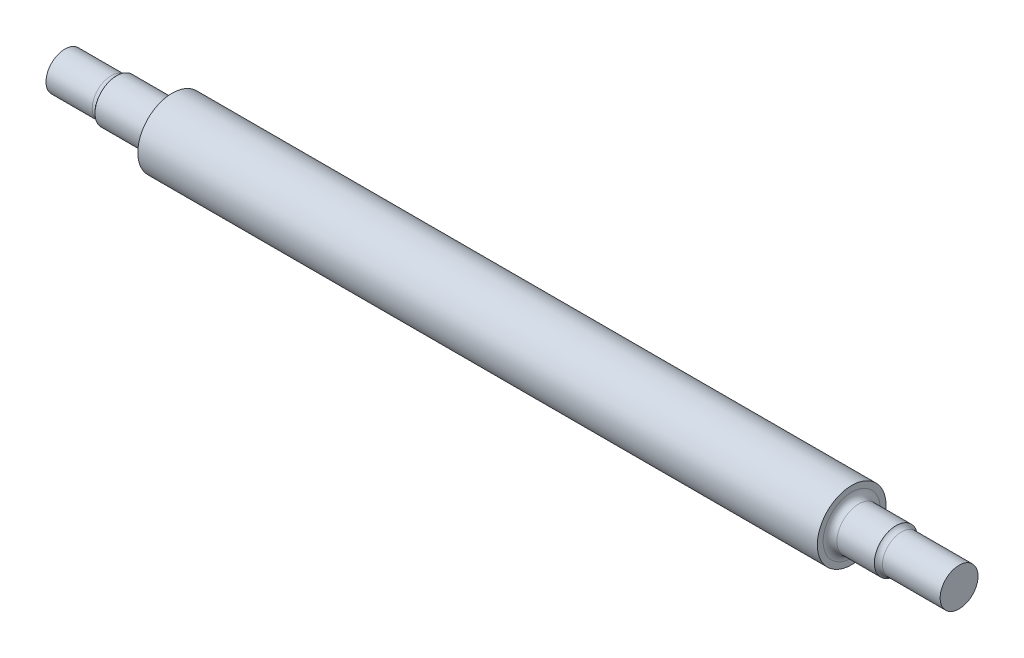
ISO-10303-21;
HEADER;
FILE_DESCRIPTION(('STEP AP214'),'2;1');
FILE_NAME('part.step','',(''),(''),'','','');
FILE_SCHEMA(('AUTOMOTIVE_DESIGN { 1 0 10303 214 1 1 1 1 }'));
ENDSEC;
DATA;
#1=APPLICATION_CONTEXT('core data for automotive mechanical design processes');
#2=APPLICATION_PROTOCOL_DEFINITION('international standard','automotive_design',2000,#1);
#3=PRODUCT_CONTEXT('',#1,'mechanical');
#4=PRODUCT('Part','Part','',(#3));
#5=PRODUCT_RELATED_PRODUCT_CATEGORY('part','',(#4));
#6=PRODUCT_DEFINITION_FORMATION('','',#4);
#7=PRODUCT_DEFINITION_CONTEXT('part definition',#1,'design');
#8=PRODUCT_DEFINITION('design','',#6,#7);
#9=PRODUCT_DEFINITION_SHAPE('','',#8);
#10=(LENGTH_UNIT() NAMED_UNIT(*) SI_UNIT(.MILLI.,.METRE.));
#11=(NAMED_UNIT(*) PLANE_ANGLE_UNIT() SI_UNIT($,.RADIAN.));
#12=(NAMED_UNIT(*) SI_UNIT($,.STERADIAN.) SOLID_ANGLE_UNIT());
#13=UNCERTAINTY_MEASURE_WITH_UNIT(LENGTH_MEASURE(1.E-05),#10,'distance_accuracy_value','');
#14=(GEOMETRIC_REPRESENTATION_CONTEXT(3) GLOBAL_UNCERTAINTY_ASSIGNED_CONTEXT((#13)) GLOBAL_UNIT_ASSIGNED_CONTEXT((#10,
#11,#12)) REPRESENTATION_CONTEXT('',''));
#15=CARTESIAN_POINT('',(0.,0.,0.));
#16=DIRECTION('',(0.,0.,1.));
#17=DIRECTION('',(1.,0.,0.));
#18=AXIS2_PLACEMENT_3D('',#15,#16,#17);
#19=CARTESIAN_POINT('',(87.741935483871,0.,-3.5));
#20=DIRECTION('',(1.,0.,0.));
#21=DIRECTION('',(0.,0.,-1.));
#22=AXIS2_PLACEMENT_3D('',#19,#20,#21);
#23=PLANE('',#22);
#24=CARTESIAN_POINT('',(87.741935483871,0.,0.));
#25=DIRECTION('',(-1.,0.,0.));
#26=DIRECTION('',(0.,0.,1.));
#27=AXIS2_PLACEMENT_3D('',#24,#25,#26);
#28=CIRCLE('',#27,3.5);
#29=CARTESIAN_POINT('',(87.741935483871,0.,3.5));
#30=VERTEX_POINT('',#29);
#31=EDGE_CURVE('E65',#30,#30,#28,.T.);
#32=ORIENTED_EDGE('',*,*,#31,.F.);
#33=EDGE_LOOP('',(#32));
#34=FACE_BOUND('',#33,.T.);
#35=ADVANCED_FACE('F38',(#34),#23,.T.);
#36=CARTESIAN_POINT('',(-77.4193548387097,0.,0.));
#37=DIRECTION('',(-1.,0.,0.));
#38=DIRECTION('',(0.,0.,1.));
#39=AXIS2_PLACEMENT_3D('',#36,#37,#38);
#40=CYLINDRICAL_SURFACE('',#39,3.5);
#41=CARTESIAN_POINT('',(77.092283397062,0.,0.));
#42=DIRECTION('',(-1.,0.,0.));
#43=DIRECTION('',(0.,0.,1.));
#44=AXIS2_PLACEMENT_3D('',#41,#42,#43);
#45=CIRCLE('',#44,3.5);
#46=CARTESIAN_POINT('',(77.092283397062,0.,3.5));
#47=VERTEX_POINT('',#46);
#48=EDGE_CURVE('E50',#47,#47,#45,.F.);
#49=ORIENTED_EDGE('',*,*,#48,.T.);
#50=EDGE_LOOP('',(#49));
#51=FACE_BOUND('',#50,.T.);
#52=ORIENTED_EDGE('',*,*,#31,.T.);
#53=EDGE_LOOP('',(#52));
#54=FACE_BOUND('',#53,.T.);
#55=ADVANCED_FACE('F206',(#51,#54),#40,.T.);
#56=CARTESIAN_POINT('',(-77.4193548387097,0.,0.));
#57=DIRECTION('',(-1.,0.,0.));
#58=DIRECTION('',(0.,0.,1.));
#59=AXIS2_PLACEMENT_3D('',#56,#57,#58);
#60=CYLINDRICAL_SURFACE('',#59,4.);
#61=CARTESIAN_POINT('',(69.1744232258064,0.,0.));
#62=DIRECTION('',(1.,0.,0.));
#63=DIRECTION('',(0.,0.,-1.));
#64=AXIS2_PLACEMENT_3D('',#61,#62,#63);
#65=CIRCLE('',#64,4.);
#66=CARTESIAN_POINT('',(69.1744232258064,0.,-4.));
#67=VERTEX_POINT('',#66);
#68=EDGE_CURVE('E10',#67,#67,#65,.T.);
#69=ORIENTED_EDGE('',*,*,#68,.T.);
#70=EDGE_LOOP('',(#69));
#71=FACE_BOUND('',#70,.T.);
#72=CARTESIAN_POINT('',(76.0823329032258,0.,0.));
#73=DIRECTION('',(-1.,0.,0.));
#74=DIRECTION('',(0.,0.,1.));
#75=AXIS2_PLACEMENT_3D('',#72,#73,#74);
#76=CIRCLE('',#75,4.);
#77=CARTESIAN_POINT('',(76.0823329032258,0.,4.));
#78=VERTEX_POINT('',#77);
#79=EDGE_CURVE('E68',#78,#78,#76,.T.);
#80=ORIENTED_EDGE('',*,*,#79,.T.);
#81=EDGE_LOOP('',(#80));
#82=FACE_BOUND('',#81,.T.);
#83=ADVANCED_FACE('F203',(#71,#82),#60,.T.);
#84=CARTESIAN_POINT('',(67.9044232258064,0.,-6.35));
#85=DIRECTION('',(1.,0.,0.));
#86=DIRECTION('',(0.,0.,-1.));
#87=AXIS2_PLACEMENT_3D('',#84,#85,#86);
#88=PLANE('',#87);
#89=CARTESIAN_POINT('',(67.9044232258064,0.,0.));
#90=DIRECTION('',(1.,0.,0.));
#91=DIRECTION('',(0.,0.,-1.));
#92=AXIS2_PLACEMENT_3D('',#89,#90,#91);
#93=CIRCLE('',#92,5.27);
#94=CARTESIAN_POINT('',(67.9044232258064,0.,-5.27));
#95=VERTEX_POINT('',#94);
#96=EDGE_CURVE('E46',#95,#95,#93,.F.);
#97=ORIENTED_EDGE('',*,*,#96,.T.);
#98=EDGE_LOOP('',(#97));
#99=FACE_BOUND('',#98,.T.);
#100=CARTESIAN_POINT('',(67.9044232258065,0.,0.));
#101=DIRECTION('',(-1.,0.,0.));
#102=DIRECTION('',(0.,0.,1.));
#103=AXIS2_PLACEMENT_3D('',#100,#101,#102);
#104=CIRCLE('',#103,6.35);
#105=CARTESIAN_POINT('',(67.9044232258065,0.,6.35));
#106=VERTEX_POINT('',#105);
#107=EDGE_CURVE('E71',#106,#106,#104,.T.);
#108=ORIENTED_EDGE('',*,*,#107,.F.);
#109=EDGE_LOOP('',(#108));
#110=FACE_BOUND('',#109,.T.);
#111=ADVANCED_FACE('F199',(#99,#110),#88,.T.);
#112=CARTESIAN_POINT('',(-77.4193548387097,0.,0.));
#113=DIRECTION('',(-1.,0.,0.));
#114=DIRECTION('',(0.,0.,1.));
#115=AXIS2_PLACEMENT_3D('',#112,#113,#114);
#116=CYLINDRICAL_SURFACE('',#115,6.35);
#117=ORIENTED_EDGE('',*,*,#107,.T.);
#118=EDGE_LOOP('',(#117));
#119=FACE_BOUND('',#118,.T.);
#120=CARTESIAN_POINT('',(-57.6087122580646,0.,0.));
#121=DIRECTION('',(-1.,0.,0.));
#122=DIRECTION('',(0.,0.,1.));
#123=AXIS2_PLACEMENT_3D('',#120,#121,#122);
#124=CIRCLE('',#123,6.35);
#125=CARTESIAN_POINT('',(-57.6087122580646,0.,6.35));
#126=VERTEX_POINT('',#125);
#127=EDGE_CURVE('E74',#126,#126,#124,.T.);
#128=ORIENTED_EDGE('',*,*,#127,.F.);
#129=EDGE_LOOP('',(#128));
#130=FACE_BOUND('',#129,.T.);
#131=ADVANCED_FACE('F195',(#119,#130),#116,.T.);
#132=CARTESIAN_POINT('',(-57.6087122580646,0.,-4.));
#133=DIRECTION('',(-1.,0.,0.));
#134=DIRECTION('',(0.,0.,1.));
#135=AXIS2_PLACEMENT_3D('',#132,#133,#134);
#136=PLANE('',#135);
#137=CARTESIAN_POINT('',(-57.6087122580646,0.,0.));
#138=DIRECTION('',(-1.,0.,0.));
#139=DIRECTION('',(0.,0.,1.));
#140=AXIS2_PLACEMENT_3D('',#137,#138,#139);
#141=CIRCLE('',#140,5.27);
#142=CARTESIAN_POINT('',(-57.6087122580646,0.,5.27));
#143=VERTEX_POINT('',#142);
#144=EDGE_CURVE('E59',#143,#143,#141,.F.);
#145=ORIENTED_EDGE('',*,*,#144,.T.);
#146=EDGE_LOOP('',(#145));
#147=FACE_BOUND('',#146,.T.);
#148=ORIENTED_EDGE('',*,*,#127,.T.);
#149=EDGE_LOOP('',(#148));
#150=FACE_BOUND('',#149,.T.);
#151=ADVANCED_FACE('F191',(#147,#150),#136,.T.);
#152=CARTESIAN_POINT('',(-77.4193548387097,0.,0.));
#153=DIRECTION('',(-1.,0.,0.));
#154=DIRECTION('',(0.,0.,1.));
#155=AXIS2_PLACEMENT_3D('',#152,#153,#154);
#156=CYLINDRICAL_SURFACE('',#155,4.);
#157=CARTESIAN_POINT('',(-58.8787122580646,0.,0.));
#158=DIRECTION('',(-1.,0.,0.));
#159=DIRECTION('',(0.,0.,1.));
#160=AXIS2_PLACEMENT_3D('',#157,#158,#159);
#161=CIRCLE('',#160,4.);
#162=CARTESIAN_POINT('',(-58.8787122580646,0.,4.));
#163=VERTEX_POINT('',#162);
#164=EDGE_CURVE('E62',#163,#163,#161,.T.);
#165=ORIENTED_EDGE('',*,*,#164,.T.);
#166=EDGE_LOOP('',(#165));
#167=FACE_BOUND('',#166,.T.);
#168=CARTESIAN_POINT('',(-67.8709677419355,0.,0.));
#169=DIRECTION('',(-1.,0.,0.));
#170=DIRECTION('',(0.,0.,1.));
#171=AXIS2_PLACEMENT_3D('',#168,#169,#170);
#172=CIRCLE('',#171,4.);
#173=CARTESIAN_POINT('',(-67.8709677419355,0.,4.));
#174=VERTEX_POINT('',#173);
#175=EDGE_CURVE('E77',#174,#174,#172,.T.);
#176=ORIENTED_EDGE('',*,*,#175,.F.);
#177=EDGE_LOOP('',(#176));
#178=FACE_BOUND('',#177,.T.);
#179=ADVANCED_FACE('F187',(#167,#178),#156,.T.);
#180=CARTESIAN_POINT('',(-77.4193548387097,0.,0.));
#181=DIRECTION('',(-1.,0.,0.));
#182=DIRECTION('',(0.,0.,1.));
#183=AXIS2_PLACEMENT_3D('',#180,#181,#182);
#184=CYLINDRICAL_SURFACE('',#183,3.5);
#185=CARTESIAN_POINT('',(-68.8809182357717,0.,0.));
#186=DIRECTION('',(1.,0.,0.));
#187=DIRECTION('',(0.,0.,-1.));
#188=AXIS2_PLACEMENT_3D('',#185,#186,#187);
#189=CIRCLE('',#188,3.5);
#190=CARTESIAN_POINT('',(-68.8809182357717,0.,-3.5));
#191=VERTEX_POINT('',#190);
#192=EDGE_CURVE('E54',#191,#191,#189,.F.);
#193=ORIENTED_EDGE('',*,*,#192,.T.);
#194=EDGE_LOOP('',(#193));
#195=FACE_BOUND('',#194,.T.);
#196=CARTESIAN_POINT('',(-77.4193548387097,0.,0.));
#197=DIRECTION('',(-1.,0.,0.));
#198=DIRECTION('',(0.,0.,1.));
#199=AXIS2_PLACEMENT_3D('',#196,#197,#198);
#200=CIRCLE('',#199,3.5);
#201=CARTESIAN_POINT('',(-77.4193548387097,0.,3.5));
#202=VERTEX_POINT('',#201);
#203=EDGE_CURVE('E80',#202,#202,#200,.T.);
#204=ORIENTED_EDGE('',*,*,#203,.F.);
#205=EDGE_LOOP('',(#204));
#206=FACE_BOUND('',#205,.T.);
#207=ADVANCED_FACE('F183',(#195,#206),#184,.T.);
#208=CARTESIAN_POINT('',(-77.4193548387097,0.,0.));
#209=DIRECTION('',(-1.,0.,0.));
#210=DIRECTION('',(0.,0.,1.));
#211=AXIS2_PLACEMENT_3D('',#208,#209,#210);
#212=PLANE('',#211);
#213=ORIENTED_EDGE('',*,*,#203,.T.);
#214=EDGE_LOOP('',(#213));
#215=FACE_BOUND('',#214,.T.);
#216=ADVANCED_FACE('F179',(#215),#212,.T.);
#217=CARTESIAN_POINT('',(-58.8787122580646,0.,0.));
#218=DIRECTION('',(-1.,0.,0.));
#219=DIRECTION('',(0.,0.,1.));
#220=AXIS2_PLACEMENT_3D('',#217,#218,#219);
#221=TOROIDAL_SURFACE('',#220,5.27,1.27);
#222=ORIENTED_EDGE('',*,*,#144,.F.);
#223=EDGE_LOOP('',(#222));
#224=FACE_BOUND('',#223,.T.);
#225=ORIENTED_EDGE('',*,*,#164,.F.);
#226=EDGE_LOOP('',(#225));
#227=FACE_BOUND('',#226,.T.);
#228=ADVANCED_FACE('F182',(#224,#227),#221,.F.);
#229=CARTESIAN_POINT('',(-68.8809182357717,0.,0.));
#230=DIRECTION('',(1.,0.,0.));
#231=DIRECTION('',(0.,0.,-1.));
#232=AXIS2_PLACEMENT_3D('',#229,#230,#231);
#233=TOROIDAL_SURFACE('',#232,4.77,1.27);
#234=ORIENTED_EDGE('',*,*,#175,.T.);
#235=EDGE_LOOP('',(#234));
#236=FACE_BOUND('',#235,.T.);
#237=ORIENTED_EDGE('',*,*,#192,.F.);
#238=EDGE_LOOP('',(#237));
#239=FACE_BOUND('',#238,.T.);
#240=ADVANCED_FACE('F215',(#236,#239),#233,.F.);
#241=CARTESIAN_POINT('',(77.092283397062,0.,0.));
#242=DIRECTION('',(-1.,0.,0.));
#243=DIRECTION('',(0.,0.,1.));
#244=AXIS2_PLACEMENT_3D('',#241,#242,#243);
#245=TOROIDAL_SURFACE('',#244,4.77,1.27);
#246=ORIENTED_EDGE('',*,*,#48,.F.);
#247=EDGE_LOOP('',(#246));
#248=FACE_BOUND('',#247,.T.);
#249=ORIENTED_EDGE('',*,*,#79,.F.);
#250=EDGE_LOOP('',(#249));
#251=FACE_BOUND('',#250,.T.);
#252=ADVANCED_FACE('F218',(#248,#251),#245,.F.);
#253=CARTESIAN_POINT('',(69.1744232258064,0.,0.));
#254=DIRECTION('',(1.,0.,0.));
#255=DIRECTION('',(0.,0.,-1.));
#256=AXIS2_PLACEMENT_3D('',#253,#254,#255);
#257=TOROIDAL_SURFACE('',#256,5.27,1.27);
#258=ORIENTED_EDGE('',*,*,#68,.F.);
#259=EDGE_LOOP('',(#258));
#260=FACE_BOUND('',#259,.T.);
#261=ORIENTED_EDGE('',*,*,#96,.F.);
#262=EDGE_LOOP('',(#261));
#263=FACE_BOUND('',#262,.T.);
#264=ADVANCED_FACE('F40',(#260,#263),#257,.F.);
#265=CLOSED_SHELL('',(#35,#55,#83,#111,#131,#151,#179,#207,#216,#228,#240,#252,#264));
#266=CARTESIAN_POINT('',(85.201935483871,0.,-3.5));
#267=DIRECTION('',(1.,0.,0.));
#268=DIRECTION('',(0.,0.,-1.));
#269=AXIS2_PLACEMENT_3D('',#266,#267,#268);
#270=PLANE('',#269);
#271=CARTESIAN_POINT('',(85.201935483871,0.,0.));
#272=DIRECTION('',(-1.,0.,0.));
#273=DIRECTION('',(0.,0.,1.));
#274=AXIS2_PLACEMENT_3D('',#271,#272,#273);
#275=CIRCLE('',#274,0.96);
#276=CARTESIAN_POINT('',(85.201935483871,0.,0.96));
#277=VERTEX_POINT('',#276);
#278=EDGE_CURVE('E110',#277,#277,#275,.T.);
#279=ORIENTED_EDGE('',*,*,#278,.T.);
#280=EDGE_LOOP('',(#279));
#281=FACE_BOUND('',#280,.T.);
#282=ADVANCED_FACE('F114',(#281),#270,.F.);
#283=CARTESIAN_POINT('',(-74.8793548387097,0.,0.));
#284=DIRECTION('',(-1.,0.,0.));
#285=DIRECTION('',(0.,0.,1.));
#286=AXIS2_PLACEMENT_3D('',#283,#284,#285);
#287=PLANE('',#286);
#288=CARTESIAN_POINT('',(-74.8793548387097,0.,0.));
#289=DIRECTION('',(-1.,0.,0.));
#290=DIRECTION('',(0.,0.,1.));
#291=AXIS2_PLACEMENT_3D('',#288,#289,#290);
#292=CIRCLE('',#291,0.96);
#293=CARTESIAN_POINT('',(-74.8793548387097,0.,0.96));
#294=VERTEX_POINT('',#293);
#295=EDGE_CURVE('E83',#294,#294,#292,.T.);
#296=ORIENTED_EDGE('',*,*,#295,.F.);
#297=EDGE_LOOP('',(#296));
#298=FACE_BOUND('',#297,.T.);
#299=ADVANCED_FACE('F168',(#298),#287,.F.);
#300=CARTESIAN_POINT('',(-77.4193548387097,0.,0.));
#301=DIRECTION('',(-1.,0.,0.));
#302=DIRECTION('',(0.,0.,1.));
#303=AXIS2_PLACEMENT_3D('',#300,#301,#302);
#304=CYLINDRICAL_SURFACE('',#303,0.96);
#305=CARTESIAN_POINT('',(-65.3309677419355,0.,0.));
#306=DIRECTION('',(-1.,0.,0.));
#307=DIRECTION('',(0.,0.,1.));
#308=AXIS2_PLACEMENT_3D('',#305,#306,#307);
#309=CIRCLE('',#308,0.96);
#310=CARTESIAN_POINT('',(-65.3309677419355,0.,0.96));
#311=VERTEX_POINT('',#310);
#312=EDGE_CURVE('E86',#311,#311,#309,.T.);
#313=ORIENTED_EDGE('',*,*,#312,.F.);
#314=EDGE_LOOP('',(#313));
#315=FACE_BOUND('',#314,.T.);
#316=ORIENTED_EDGE('',*,*,#295,.T.);
#317=EDGE_LOOP('',(#316));
#318=FACE_BOUND('',#317,.T.);
#319=ADVANCED_FACE('F162',(#315,#318),#304,.F.);
#320=CARTESIAN_POINT('',(-65.3309677419355,0.,-3.5));
#321=DIRECTION('',(-1.,0.,0.));
#322=DIRECTION('',(0.,0.,1.));
#323=AXIS2_PLACEMENT_3D('',#320,#321,#322);
#324=PLANE('',#323);
#325=CARTESIAN_POINT('',(-65.3309677419355,0.,0.));
#326=DIRECTION('',(-1.,0.,0.));
#327=DIRECTION('',(0.,0.,1.));
#328=AXIS2_PLACEMENT_3D('',#325,#326,#327);
#329=CIRCLE('',#328,1.46);
#330=CARTESIAN_POINT('',(-65.3309677419355,0.,1.46));
#331=VERTEX_POINT('',#330);
#332=EDGE_CURVE('E89',#331,#331,#329,.T.);
#333=ORIENTED_EDGE('',*,*,#332,.F.);
#334=EDGE_LOOP('',(#333));
#335=FACE_BOUND('',#334,.T.);
#336=ORIENTED_EDGE('',*,*,#312,.T.);
#337=EDGE_LOOP('',(#336));
#338=FACE_BOUND('',#337,.T.);
#339=ADVANCED_FACE('F156',(#335,#338),#324,.F.);
#340=CARTESIAN_POINT('',(-77.4193548387097,0.,0.));
#341=DIRECTION('',(-1.,0.,0.));
#342=DIRECTION('',(0.,0.,1.));
#343=AXIS2_PLACEMENT_3D('',#340,#341,#342);
#344=CYLINDRICAL_SURFACE('',#343,1.46);
#345=CARTESIAN_POINT('',(-55.0687122580646,0.,0.));
#346=DIRECTION('',(-1.,0.,0.));
#347=DIRECTION('',(0.,0.,1.));
#348=AXIS2_PLACEMENT_3D('',#345,#346,#347);
#349=CIRCLE('',#348,1.46);
#350=CARTESIAN_POINT('',(-55.0687122580646,0.,1.46));
#351=VERTEX_POINT('',#350);
#352=EDGE_CURVE('E92',#351,#351,#349,.T.);
#353=ORIENTED_EDGE('',*,*,#352,.F.);
#354=EDGE_LOOP('',(#353));
#355=FACE_BOUND('',#354,.T.);
#356=ORIENTED_EDGE('',*,*,#332,.T.);
#357=EDGE_LOOP('',(#356));
#358=FACE_BOUND('',#357,.T.);
#359=ADVANCED_FACE('F150',(#355,#358),#344,.F.);
#360=CARTESIAN_POINT('',(-55.0687122580646,0.,-4.));
#361=DIRECTION('',(-1.,0.,0.));
#362=DIRECTION('',(0.,0.,1.));
#363=AXIS2_PLACEMENT_3D('',#360,#361,#362);
#364=PLANE('',#363);
#365=CARTESIAN_POINT('',(-55.0687122580646,0.,0.));
#366=DIRECTION('',(-1.,0.,0.));
#367=DIRECTION('',(0.,0.,1.));
#368=AXIS2_PLACEMENT_3D('',#365,#366,#367);
#369=CIRCLE('',#368,3.81);
#370=CARTESIAN_POINT('',(-55.0687122580646,0.,3.81));
#371=VERTEX_POINT('',#370);
#372=EDGE_CURVE('E95',#371,#371,#369,.T.);
#373=ORIENTED_EDGE('',*,*,#372,.F.);
#374=EDGE_LOOP('',(#373));
#375=FACE_BOUND('',#374,.T.);
#376=ORIENTED_EDGE('',*,*,#352,.T.);
#377=EDGE_LOOP('',(#376));
#378=FACE_BOUND('',#377,.T.);
#379=ADVANCED_FACE('F144',(#375,#378),#364,.F.);
#380=CARTESIAN_POINT('',(-77.4193548387097,0.,0.));
#381=DIRECTION('',(-1.,0.,0.));
#382=DIRECTION('',(0.,0.,1.));
#383=AXIS2_PLACEMENT_3D('',#380,#381,#382);
#384=CYLINDRICAL_SURFACE('',#383,3.81);
#385=CARTESIAN_POINT('',(65.3644232258064,0.,0.));
#386=DIRECTION('',(-1.,0.,0.));
#387=DIRECTION('',(0.,0.,1.));
#388=AXIS2_PLACEMENT_3D('',#385,#386,#387);
#389=CIRCLE('',#388,3.81);
#390=CARTESIAN_POINT('',(65.3644232258064,0.,3.81));
#391=VERTEX_POINT('',#390);
#392=EDGE_CURVE('E98',#391,#391,#389,.T.);
#393=ORIENTED_EDGE('',*,*,#392,.F.);
#394=EDGE_LOOP('',(#393));
#395=FACE_BOUND('',#394,.T.);
#396=ORIENTED_EDGE('',*,*,#372,.T.);
#397=EDGE_LOOP('',(#396));
#398=FACE_BOUND('',#397,.T.);
#399=ADVANCED_FACE('F138',(#395,#398),#384,.F.);
#400=CARTESIAN_POINT('',(65.3644232258064,0.,-6.35));
#401=DIRECTION('',(1.,0.,0.));
#402=DIRECTION('',(0.,0.,-1.));
#403=AXIS2_PLACEMENT_3D('',#400,#401,#402);
#404=PLANE('',#403);
#405=CARTESIAN_POINT('',(65.3644232258064,0.,0.));
#406=DIRECTION('',(-1.,0.,0.));
#407=DIRECTION('',(0.,0.,1.));
#408=AXIS2_PLACEMENT_3D('',#405,#406,#407);
#409=CIRCLE('',#408,1.46);
#410=CARTESIAN_POINT('',(65.3644232258064,0.,1.46));
#411=VERTEX_POINT('',#410);
#412=EDGE_CURVE('E101',#411,#411,#409,.T.);
#413=ORIENTED_EDGE('',*,*,#412,.F.);
#414=EDGE_LOOP('',(#413));
#415=FACE_BOUND('',#414,.T.);
#416=ORIENTED_EDGE('',*,*,#392,.T.);
#417=EDGE_LOOP('',(#416));
#418=FACE_BOUND('',#417,.T.);
#419=ADVANCED_FACE('F132',(#415,#418),#404,.F.);
#420=CARTESIAN_POINT('',(-77.4193548387097,0.,0.));
#421=DIRECTION('',(-1.,0.,0.));
#422=DIRECTION('',(0.,0.,1.));
#423=AXIS2_PLACEMENT_3D('',#420,#421,#422);
#424=CYLINDRICAL_SURFACE('',#423,1.46);
#425=CARTESIAN_POINT('',(73.5423329032258,0.,0.));
#426=DIRECTION('',(-1.,0.,0.));
#427=DIRECTION('',(0.,0.,1.));
#428=AXIS2_PLACEMENT_3D('',#425,#426,#427);
#429=CIRCLE('',#428,1.46);
#430=CARTESIAN_POINT('',(73.5423329032258,0.,1.46));
#431=VERTEX_POINT('',#430);
#432=EDGE_CURVE('E104',#431,#431,#429,.T.);
#433=ORIENTED_EDGE('',*,*,#432,.F.);
#434=EDGE_LOOP('',(#433));
#435=FACE_BOUND('',#434,.T.);
#436=ORIENTED_EDGE('',*,*,#412,.T.);
#437=EDGE_LOOP('',(#436));
#438=FACE_BOUND('',#437,.T.);
#439=ADVANCED_FACE('F126',(#435,#438),#424,.F.);
#440=CARTESIAN_POINT('',(73.5423329032258,0.,-4.));
#441=DIRECTION('',(1.,0.,0.));
#442=DIRECTION('',(0.,0.,-1.));
#443=AXIS2_PLACEMENT_3D('',#440,#441,#442);
#444=PLANE('',#443);
#445=CARTESIAN_POINT('',(73.5423329032258,0.,0.));
#446=DIRECTION('',(-1.,0.,0.));
#447=DIRECTION('',(0.,0.,1.));
#448=AXIS2_PLACEMENT_3D('',#445,#446,#447);
#449=CIRCLE('',#448,0.96);
#450=CARTESIAN_POINT('',(73.5423329032258,0.,0.96));
#451=VERTEX_POINT('',#450);
#452=EDGE_CURVE('E107',#451,#451,#449,.T.);
#453=ORIENTED_EDGE('',*,*,#452,.F.);
#454=EDGE_LOOP('',(#453));
#455=FACE_BOUND('',#454,.T.);
#456=ORIENTED_EDGE('',*,*,#432,.T.);
#457=EDGE_LOOP('',(#456));
#458=FACE_BOUND('',#457,.T.);
#459=ADVANCED_FACE('F119',(#455,#458),#444,.F.);
#460=CARTESIAN_POINT('',(-77.4193548387097,0.,0.));
#461=DIRECTION('',(-1.,0.,0.));
#462=DIRECTION('',(0.,0.,1.));
#463=AXIS2_PLACEMENT_3D('',#460,#461,#462);
#464=CYLINDRICAL_SURFACE('',#463,0.96);
#465=ORIENTED_EDGE('',*,*,#278,.F.);
#466=EDGE_LOOP('',(#465));
#467=FACE_BOUND('',#466,.T.);
#468=ORIENTED_EDGE('',*,*,#452,.T.);
#469=EDGE_LOOP('',(#468));
#470=FACE_BOUND('',#469,.T.);
#471=ADVANCED_FACE('F116',(#467,#470),#464,.F.);
#472=CLOSED_SHELL('',(#282,#299,#319,#339,#359,#379,#399,#419,#439,#459,#471));
#473=ORIENTED_CLOSED_SHELL('',*,#472,.T.);
#474=BREP_WITH_VOIDS('B2',#265,(#473));
#475=ADVANCED_BREP_SHAPE_REPRESENTATION('',(#18,#474),#14);
#476=SHAPE_DEFINITION_REPRESENTATION(#9,#475);
ENDSEC;
END-ISO-10303-21;
